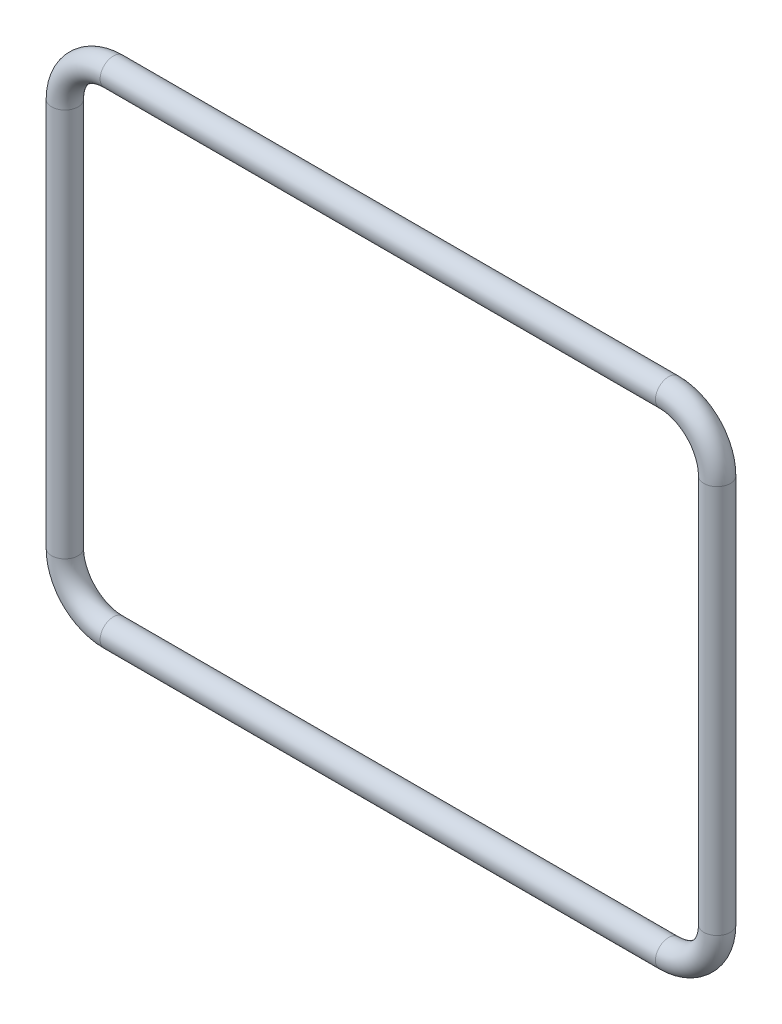
ISO-10303-21;
HEADER;
FILE_DESCRIPTION(('STEP AP214'),'2;1');
FILE_NAME('part.step','',(''),(''),'','','');
FILE_SCHEMA(('AUTOMOTIVE_DESIGN { 1 0 10303 214 1 1 1 1 }'));
ENDSEC;
DATA;
#1=APPLICATION_CONTEXT('core data for automotive mechanical design processes');
#2=APPLICATION_PROTOCOL_DEFINITION('international standard','automotive_design',2000,#1);
#3=PRODUCT_CONTEXT('',#1,'mechanical');
#4=PRODUCT('Part','Part','',(#3));
#5=PRODUCT_RELATED_PRODUCT_CATEGORY('part','',(#4));
#6=PRODUCT_DEFINITION_FORMATION('','',#4);
#7=PRODUCT_DEFINITION_CONTEXT('part definition',#1,'design');
#8=PRODUCT_DEFINITION('design','',#6,#7);
#9=PRODUCT_DEFINITION_SHAPE('','',#8);
#10=(LENGTH_UNIT() NAMED_UNIT(*) SI_UNIT(.MILLI.,.METRE.));
#11=(NAMED_UNIT(*) PLANE_ANGLE_UNIT() SI_UNIT($,.RADIAN.));
#12=(NAMED_UNIT(*) SI_UNIT($,.STERADIAN.) SOLID_ANGLE_UNIT());
#13=UNCERTAINTY_MEASURE_WITH_UNIT(LENGTH_MEASURE(1.E-05),#10,'distance_accuracy_value','');
#14=(GEOMETRIC_REPRESENTATION_CONTEXT(3) GLOBAL_UNCERTAINTY_ASSIGNED_CONTEXT((#13)) GLOBAL_UNIT_ASSIGNED_CONTEXT((#10,
#11,#12)) REPRESENTATION_CONTEXT('',''));
#15=CARTESIAN_POINT('',(0.,0.,0.));
#16=DIRECTION('',(0.,0.,1.));
#17=DIRECTION('',(1.,0.,0.));
#18=AXIS2_PLACEMENT_3D('',#15,#16,#17);
#19=CARTESIAN_POINT('',(-200.,140.,0.));
#20=DIRECTION('',(0.,0.,-1.));
#21=DIRECTION('',(-1.,0.,0.));
#22=AXIS2_PLACEMENT_3D('',#19,#20,#21);
#23=TOROIDAL_SURFACE('',#22,17.4625,4.76250000000003);
#24=CARTESIAN_POINT('',(-217.4625,140.,0.));
#25=DIRECTION('',(0.,1.,0.));
#26=DIRECTION('',(0.,0.,-1.));
#27=AXIS2_PLACEMENT_3D('',#24,#25,#26);
#28=CIRCLE('',#27,4.76250000000003);
#29=CARTESIAN_POINT('',(-222.225,140.,0.));
#30=VERTEX_POINT('',#29);
#31=EDGE_CURVE('E10',#30,#30,#28,.T.);
#32=CARTESIAN_POINT('',(-200.,157.4625,0.));
#33=DIRECTION('',(1.,0.,0.));
#34=DIRECTION('',(0.,0.,-1.));
#35=AXIS2_PLACEMENT_3D('',#32,#33,#34);
#36=CIRCLE('',#35,4.76250000000003);
#37=CARTESIAN_POINT('',(-200.,162.225,0.));
#38=VERTEX_POINT('',#37);
#39=EDGE_CURVE('E61',#38,#38,#36,.T.);
#40=CARTESIAN_POINT('',(-200.,140.,0.));
#41=DIRECTION('',(0.,0.,-1.));
#42=DIRECTION('',(-1.,0.,0.));
#43=AXIS2_PLACEMENT_3D('',#40,#41,#42);
#44=CIRCLE('',#43,22.225);
#45=EDGE_CURVE('',#30,#38,#44,.T.);
#46=ORIENTED_EDGE('',*,*,#31,.T.);
#47=ORIENTED_EDGE('',*,*,#39,.F.);
#48=ORIENTED_EDGE('',*,*,#45,.T.);
#49=ORIENTED_EDGE('',*,*,#45,.F.);
#50=EDGE_LOOP('',(#46,#48,#47,#49));
#51=FACE_BOUND('',#50,.T.);
#52=ADVANCED_FACE('F33',(#51),#23,.T.);
#53=CARTESIAN_POINT('',(-217.4625,0.,0.));
#54=DIRECTION('',(0.,1.,0.));
#55=DIRECTION('',(0.,0.,1.));
#56=AXIS2_PLACEMENT_3D('',#53,#54,#55);
#57=CYLINDRICAL_SURFACE('',#56,4.76250000000003);
#58=ORIENTED_EDGE('',*,*,#31,.F.);
#59=EDGE_LOOP('',(#58));
#60=FACE_BOUND('',#59,.T.);
#61=CARTESIAN_POINT('',(-217.4625,0.,0.));
#62=DIRECTION('',(0.,1.,0.));
#63=DIRECTION('',(0.,0.,-1.));
#64=AXIS2_PLACEMENT_3D('',#61,#62,#63);
#65=CIRCLE('',#64,4.76250000000003);
#66=CARTESIAN_POINT('',(-222.225,0.,0.));
#67=VERTEX_POINT('',#66);
#68=EDGE_CURVE('E39',#67,#67,#65,.T.);
#69=ORIENTED_EDGE('',*,*,#68,.T.);
#70=EDGE_LOOP('',(#69));
#71=FACE_BOUND('',#70,.T.);
#72=ADVANCED_FACE('F68',(#60,#71),#57,.T.);
#73=CARTESIAN_POINT('',(-200.,0.,0.));
#74=DIRECTION('',(0.,0.,-1.));
#75=DIRECTION('',(-1.,0.,0.));
#76=AXIS2_PLACEMENT_3D('',#73,#74,#75);
#77=TOROIDAL_SURFACE('',#76,17.4625,4.76250000000003);
#78=CARTESIAN_POINT('',(-200.,-17.4625,0.));
#79=DIRECTION('',(-1.,0.,0.));
#80=DIRECTION('',(0.,0.,-1.));
#81=AXIS2_PLACEMENT_3D('',#78,#79,#80);
#82=CIRCLE('',#81,4.76250000000003);
#83=CARTESIAN_POINT('',(-200.,-22.225,0.));
#84=VERTEX_POINT('',#83);
#85=EDGE_CURVE('E43',#84,#84,#82,.T.);
#86=CARTESIAN_POINT('',(-200.,0.,0.));
#87=DIRECTION('',(0.,0.,-1.));
#88=DIRECTION('',(-1.,0.,0.));
#89=AXIS2_PLACEMENT_3D('',#86,#87,#88);
#90=CIRCLE('',#89,22.225);
#91=EDGE_CURVE('',#84,#67,#90,.T.);
#92=ORIENTED_EDGE('',*,*,#85,.T.);
#93=ORIENTED_EDGE('',*,*,#68,.F.);
#94=ORIENTED_EDGE('',*,*,#91,.T.);
#95=ORIENTED_EDGE('',*,*,#91,.F.);
#96=EDGE_LOOP('',(#92,#94,#93,#95));
#97=FACE_BOUND('',#96,.T.);
#98=ADVANCED_FACE('F72',(#97),#77,.T.);
#99=CARTESIAN_POINT('',(0.,-17.4625,0.));
#100=DIRECTION('',(-1.,0.,0.));
#101=DIRECTION('',(0.,-1.,0.));
#102=AXIS2_PLACEMENT_3D('',#99,#100,#101);
#103=CYLINDRICAL_SURFACE('',#102,4.76250000000003);
#104=ORIENTED_EDGE('',*,*,#85,.F.);
#105=EDGE_LOOP('',(#104));
#106=FACE_BOUND('',#105,.T.);
#107=CARTESIAN_POINT('',(0.,-17.4625,0.));
#108=DIRECTION('',(-1.,0.,0.));
#109=DIRECTION('',(0.,0.,-1.));
#110=AXIS2_PLACEMENT_3D('',#107,#108,#109);
#111=CIRCLE('',#110,4.76250000000003);
#112=CARTESIAN_POINT('',(0.,-22.225,0.));
#113=VERTEX_POINT('',#112);
#114=EDGE_CURVE('E47',#113,#113,#111,.T.);
#115=ORIENTED_EDGE('',*,*,#114,.T.);
#116=EDGE_LOOP('',(#115));
#117=FACE_BOUND('',#116,.T.);
#118=ADVANCED_FACE('F77',(#106,#117),#103,.T.);
#119=CARTESIAN_POINT('',(0.,0.,0.));
#120=DIRECTION('',(0.,0.,-1.));
#121=DIRECTION('',(-1.,0.,0.));
#122=AXIS2_PLACEMENT_3D('',#119,#120,#121);
#123=TOROIDAL_SURFACE('',#122,17.4625,4.76250000000003);
#124=CARTESIAN_POINT('',(17.4625,0.,0.));
#125=DIRECTION('',(0.,-1.,0.));
#126=DIRECTION('',(0.,0.,-1.));
#127=AXIS2_PLACEMENT_3D('',#124,#125,#126);
#128=CIRCLE('',#127,4.76250000000003);
#129=CARTESIAN_POINT('',(22.225,0.,0.));
#130=VERTEX_POINT('',#129);
#131=EDGE_CURVE('E52',#130,#130,#128,.T.);
#132=CARTESIAN_POINT('',(0.,0.,0.));
#133=DIRECTION('',(0.,0.,-1.));
#134=DIRECTION('',(-1.,0.,0.));
#135=AXIS2_PLACEMENT_3D('',#132,#133,#134);
#136=CIRCLE('',#135,22.225);
#137=EDGE_CURVE('',#130,#113,#136,.T.);
#138=ORIENTED_EDGE('',*,*,#131,.T.);
#139=ORIENTED_EDGE('',*,*,#114,.F.);
#140=ORIENTED_EDGE('',*,*,#137,.T.);
#141=ORIENTED_EDGE('',*,*,#137,.F.);
#142=EDGE_LOOP('',(#138,#140,#139,#141));
#143=FACE_BOUND('',#142,.T.);
#144=ADVANCED_FACE('F83',(#143),#123,.T.);
#145=CARTESIAN_POINT('',(17.4625,140.,0.));
#146=DIRECTION('',(0.,-1.,0.));
#147=DIRECTION('',(1.,0.,0.));
#148=AXIS2_PLACEMENT_3D('',#145,#146,#147);
#149=CYLINDRICAL_SURFACE('',#148,4.76250000000003);
#150=ORIENTED_EDGE('',*,*,#131,.F.);
#151=EDGE_LOOP('',(#150));
#152=FACE_BOUND('',#151,.T.);
#153=CARTESIAN_POINT('',(17.4625,140.,0.));
#154=DIRECTION('',(0.,-1.,0.));
#155=DIRECTION('',(0.,0.,-1.));
#156=AXIS2_PLACEMENT_3D('',#153,#154,#155);
#157=CIRCLE('',#156,4.76250000000003);
#158=CARTESIAN_POINT('',(22.225,140.,0.));
#159=VERTEX_POINT('',#158);
#160=EDGE_CURVE('E55',#159,#159,#157,.T.);
#161=ORIENTED_EDGE('',*,*,#160,.T.);
#162=EDGE_LOOP('',(#161));
#163=FACE_BOUND('',#162,.T.);
#164=ADVANCED_FACE('F87',(#152,#163),#149,.T.);
#165=CARTESIAN_POINT('',(0.,140.,0.));
#166=DIRECTION('',(0.,0.,-1.));
#167=DIRECTION('',(-1.,0.,0.));
#168=AXIS2_PLACEMENT_3D('',#165,#166,#167);
#169=TOROIDAL_SURFACE('',#168,17.4625,4.76250000000003);
#170=CARTESIAN_POINT('',(0.,157.4625,0.));
#171=DIRECTION('',(1.,0.,0.));
#172=DIRECTION('',(0.,0.,-1.));
#173=AXIS2_PLACEMENT_3D('',#170,#171,#172);
#174=CIRCLE('',#173,4.76250000000003);
#175=CARTESIAN_POINT('',(0.,162.225,0.));
#176=VERTEX_POINT('',#175);
#177=EDGE_CURVE('E58',#176,#176,#174,.T.);
#178=CARTESIAN_POINT('',(0.,140.,0.));
#179=DIRECTION('',(0.,0.,-1.));
#180=DIRECTION('',(-1.,0.,0.));
#181=AXIS2_PLACEMENT_3D('',#178,#179,#180);
#182=CIRCLE('',#181,22.225);
#183=EDGE_CURVE('',#176,#159,#182,.T.);
#184=ORIENTED_EDGE('',*,*,#177,.T.);
#185=ORIENTED_EDGE('',*,*,#160,.F.);
#186=ORIENTED_EDGE('',*,*,#183,.T.);
#187=ORIENTED_EDGE('',*,*,#183,.F.);
#188=EDGE_LOOP('',(#184,#186,#185,#187));
#189=FACE_BOUND('',#188,.T.);
#190=ADVANCED_FACE('F91',(#189),#169,.T.);
#191=CARTESIAN_POINT('',(-200.,157.4625,0.));
#192=DIRECTION('',(1.,0.,0.));
#193=DIRECTION('',(0.,1.,0.));
#194=AXIS2_PLACEMENT_3D('',#191,#192,#193);
#195=CYLINDRICAL_SURFACE('',#194,4.76250000000003);
#196=ORIENTED_EDGE('',*,*,#177,.F.);
#197=EDGE_LOOP('',(#196));
#198=FACE_BOUND('',#197,.T.);
#199=ORIENTED_EDGE('',*,*,#39,.T.);
#200=EDGE_LOOP('',(#199));
#201=FACE_BOUND('',#200,.T.);
#202=ADVANCED_FACE('F65',(#198,#201),#195,.T.);
#203=CLOSED_SHELL('',(#52,#72,#98,#118,#144,#164,#190,#202));
#204=MANIFOLD_SOLID_BREP('B2',#203);
#205=ADVANCED_BREP_SHAPE_REPRESENTATION('',(#18,#204),#14);
#206=SHAPE_DEFINITION_REPRESENTATION(#9,#205);
ENDSEC;
END-ISO-10303-21;
